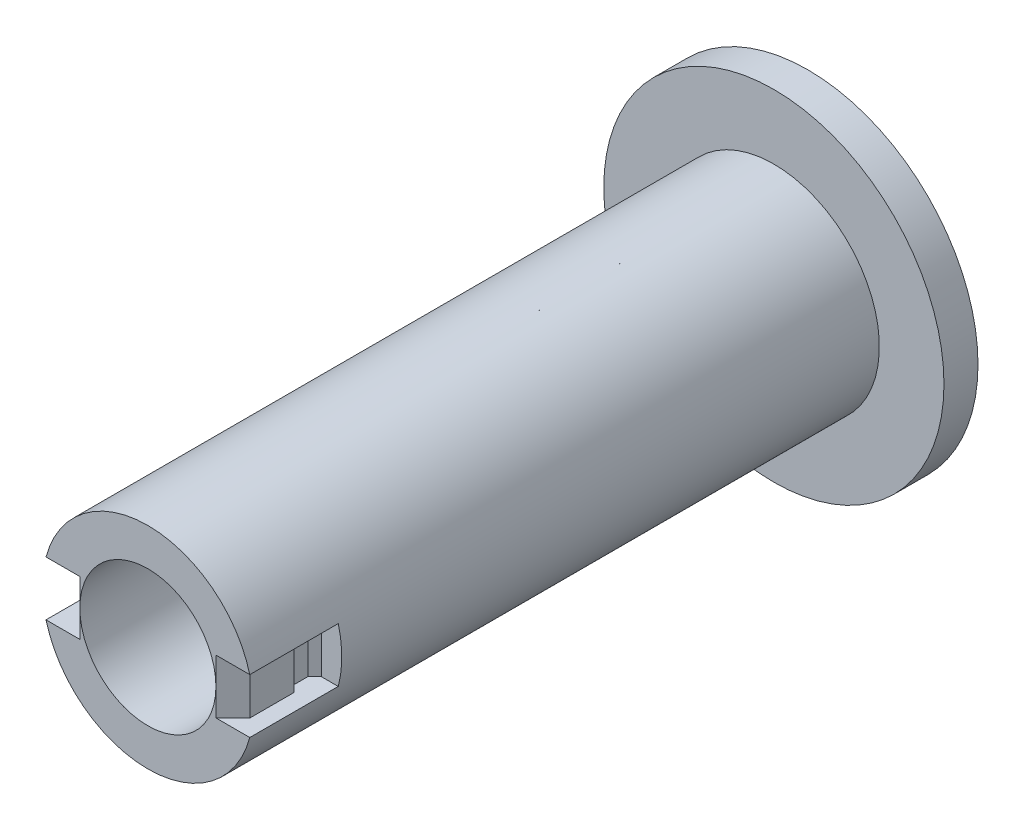
ISO-10303-21;
HEADER;
FILE_DESCRIPTION(('STEP AP214'),'2;1');
FILE_NAME('part.step','',(''),(''),'','','');
FILE_SCHEMA(('AUTOMOTIVE_DESIGN { 1 0 10303 214 1 1 1 1 }'));
ENDSEC;
DATA;
#1=APPLICATION_CONTEXT('core data for automotive mechanical design processes');
#2=APPLICATION_PROTOCOL_DEFINITION('international standard','automotive_design',2000,#1);
#3=PRODUCT_CONTEXT('',#1,'mechanical');
#4=PRODUCT('Part','Part','',(#3));
#5=PRODUCT_RELATED_PRODUCT_CATEGORY('part','',(#4));
#6=PRODUCT_DEFINITION_FORMATION('','',#4);
#7=PRODUCT_DEFINITION_CONTEXT('part definition',#1,'design');
#8=PRODUCT_DEFINITION('design','',#6,#7);
#9=PRODUCT_DEFINITION_SHAPE('','',#8);
#10=(LENGTH_UNIT() NAMED_UNIT(*) SI_UNIT(.MILLI.,.METRE.));
#11=(NAMED_UNIT(*) PLANE_ANGLE_UNIT() SI_UNIT($,.RADIAN.));
#12=(NAMED_UNIT(*) SI_UNIT($,.STERADIAN.) SOLID_ANGLE_UNIT());
#13=UNCERTAINTY_MEASURE_WITH_UNIT(LENGTH_MEASURE(1.E-05),#10,'distance_accuracy_value','');
#14=(GEOMETRIC_REPRESENTATION_CONTEXT(3) GLOBAL_UNCERTAINTY_ASSIGNED_CONTEXT((#13)) GLOBAL_UNIT_ASSIGNED_CONTEXT((#10,
#11,#12)) REPRESENTATION_CONTEXT('',''));
#15=CARTESIAN_POINT('',(0.,0.,0.));
#16=DIRECTION('',(0.,0.,1.));
#17=DIRECTION('',(1.,0.,0.));
#18=AXIS2_PLACEMENT_3D('',#15,#16,#17);
#19=CARTESIAN_POINT('',(0.,0.,92.));
#20=DIRECTION('',(0.,0.,1.));
#21=DIRECTION('',(1.,0.,0.));
#22=AXIS2_PLACEMENT_3D('',#19,#20,#21);
#23=PLANE('',#22);
#24=DIRECTION('',(-1.,0.,0.));
#25=VECTOR('',#24,1.);
#26=CARTESIAN_POINT('',(0.,4.,92.));
#27=LINE('',#26,#25);
#28=CARTESIAN_POINT('',(-10.,4.,92.));
#29=VERTEX_POINT('',#28);
#30=CARTESIAN_POINT('',(-14.9749791318719,4.,92.));
#31=VERTEX_POINT('',#30);
#32=EDGE_CURVE('E190',#29,#31,#27,.T.);
#33=ORIENTED_EDGE('',*,*,#32,.F.);
#34=DIRECTION('',(0.,-1.,0.));
#35=VECTOR('',#34,1.);
#36=CARTESIAN_POINT('',(-10.,4.,92.));
#37=LINE('',#36,#35);
#38=CARTESIAN_POINT('',(-10.,0.,92.));
#39=VERTEX_POINT('',#38);
#40=EDGE_CURVE('E168',#29,#39,#37,.T.);
#41=ORIENTED_EDGE('',*,*,#40,.T.);
#42=CARTESIAN_POINT('',(0.,0.,92.));
#43=DIRECTION('',(0.,0.,1.));
#44=DIRECTION('',(1.,0.,0.));
#45=AXIS2_PLACEMENT_3D('',#42,#43,#44);
#46=CIRCLE('',#45,10.);
#47=CARTESIAN_POINT('',(10.,0.,92.));
#48=VERTEX_POINT('',#47);
#49=EDGE_CURVE('E276',#48,#39,#46,.T.);
#50=ORIENTED_EDGE('',*,*,#49,.F.);
#51=DIRECTION('',(0.,-1.,0.));
#52=VECTOR('',#51,1.);
#53=CARTESIAN_POINT('',(10.,4.,92.));
#54=LINE('',#53,#52);
#55=CARTESIAN_POINT('',(10.,4.,92.));
#56=VERTEX_POINT('',#55);
#57=EDGE_CURVE('E255',#56,#48,#54,.T.);
#58=ORIENTED_EDGE('',*,*,#57,.F.);
#59=DIRECTION('',(1.,0.,0.));
#60=VECTOR('',#59,1.);
#61=CARTESIAN_POINT('',(0.,4.,92.));
#62=LINE('',#61,#60);
#63=CARTESIAN_POINT('',(14.9749791318719,4.,92.));
#64=VERTEX_POINT('',#63);
#65=EDGE_CURVE('E246',#56,#64,#62,.T.);
#66=ORIENTED_EDGE('',*,*,#65,.T.);
#67=CARTESIAN_POINT('',(0.,0.,92.));
#68=DIRECTION('',(0.,0.,1.));
#69=DIRECTION('',(1.,0.,0.));
#70=AXIS2_PLACEMENT_3D('',#67,#68,#69);
#71=CIRCLE('',#70,15.5);
#72=EDGE_CURVE('E288',#64,#31,#71,.T.);
#73=ORIENTED_EDGE('',*,*,#72,.T.);
#74=EDGE_LOOP('',(#33,#41,#50,#58,#66,#73));
#75=FACE_BOUND('',#74,.T.);
#76=ADVANCED_FACE('F32',(#75),#23,.T.);
#77=CARTESIAN_POINT('',(0.,0.,92.));
#78=DIRECTION('',(0.,0.,-1.));
#79=DIRECTION('',(-1.,0.,0.));
#80=AXIS2_PLACEMENT_3D('',#77,#78,#79);
#81=CYLINDRICAL_SURFACE('',#80,15.5);
#82=CARTESIAN_POINT('',(0.,0.,79.));
#83=DIRECTION('',(0.,0.,-1.));
#84=DIRECTION('',(-1.,0.,0.));
#85=AXIS2_PLACEMENT_3D('',#82,#83,#84);
#86=CIRCLE('',#85,15.5);
#87=CARTESIAN_POINT('',(-14.9749791318719,-4.,79.));
#88=VERTEX_POINT('',#87);
#89=CARTESIAN_POINT('',(-14.9749791318719,4.,79.));
#90=VERTEX_POINT('',#89);
#91=EDGE_CURVE('E11',#88,#90,#86,.T.);
#92=ORIENTED_EDGE('',*,*,#91,.T.);
#93=DIRECTION('',(0.,0.,-1.));
#94=VECTOR('',#93,1.);
#95=CARTESIAN_POINT('',(-14.9749791318719,4.,92.));
#96=LINE('',#95,#94);
#97=EDGE_CURVE('E216',#90,#31,#96,.F.);
#98=ORIENTED_EDGE('',*,*,#97,.T.);
#99=ORIENTED_EDGE('',*,*,#72,.F.);
#100=DIRECTION('',(0.,0.,-1.));
#101=VECTOR('',#100,1.);
#102=CARTESIAN_POINT('',(14.9749791318719,4.,92.));
#103=LINE('',#102,#101);
#104=CARTESIAN_POINT('',(14.9749791318719,4.,79.));
#105=VERTEX_POINT('',#104);
#106=EDGE_CURVE('E268',#64,#105,#103,.T.);
#107=ORIENTED_EDGE('',*,*,#106,.T.);
#108=CARTESIAN_POINT('',(0.,0.,79.));
#109=DIRECTION('',(0.,0.,1.));
#110=DIRECTION('',(1.,0.,0.));
#111=AXIS2_PLACEMENT_3D('',#108,#109,#110);
#112=CIRCLE('',#111,15.5);
#113=CARTESIAN_POINT('',(14.9749791318719,-4.,79.));
#114=VERTEX_POINT('',#113);
#115=EDGE_CURVE('E40',#114,#105,#112,.T.);
#116=ORIENTED_EDGE('',*,*,#115,.F.);
#117=DIRECTION('',(0.,0.,-1.));
#118=VECTOR('',#117,1.);
#119=CARTESIAN_POINT('',(14.9749791318719,-4.,92.));
#120=LINE('',#119,#118);
#121=CARTESIAN_POINT('',(14.9749791318719,-4.,92.));
#122=VERTEX_POINT('',#121);
#123=EDGE_CURVE('E266',#122,#114,#120,.T.);
#124=ORIENTED_EDGE('',*,*,#123,.F.);
#125=CARTESIAN_POINT('',(-14.9749791318719,-4.,92.));
#126=VERTEX_POINT('',#125);
#127=EDGE_CURVE('E287',#126,#122,#71,.T.);
#128=ORIENTED_EDGE('',*,*,#127,.F.);
#129=DIRECTION('',(0.,0.,-1.));
#130=VECTOR('',#129,1.);
#131=CARTESIAN_POINT('',(-14.9749791318719,-4.,92.));
#132=LINE('',#131,#130);
#133=EDGE_CURVE('E47',#88,#126,#132,.F.);
#134=ORIENTED_EDGE('',*,*,#133,.F.);
#135=EDGE_LOOP('',(#92,#98,#99,#107,#116,#124,#128,#134));
#136=FACE_BOUND('',#135,.T.);
#137=CARTESIAN_POINT('',(0.,0.,0.));
#138=DIRECTION('',(0.,0.,-1.));
#139=DIRECTION('',(-1.,0.,0.));
#140=AXIS2_PLACEMENT_3D('',#137,#138,#139);
#141=CIRCLE('',#140,15.5);
#142=CARTESIAN_POINT('',(-15.5,0.,0.));
#143=VERTEX_POINT('',#142);
#144=EDGE_CURVE('E282',#143,#143,#141,.T.);
#145=ORIENTED_EDGE('',*,*,#144,.F.);
#146=EDGE_LOOP('',(#145));
#147=FACE_BOUND('',#146,.T.);
#148=ADVANCED_FACE('F34',(#136,#147),#81,.T.);
#149=CARTESIAN_POINT('',(-10.,-4.,92.));
#150=VERTEX_POINT('',#149);
#151=EDGE_CURVE('E212',#39,#150,#37,.T.);
#152=ORIENTED_EDGE('',*,*,#151,.T.);
#153=DIRECTION('',(-1.,0.,0.));
#154=VECTOR('',#153,1.);
#155=CARTESIAN_POINT('',(0.,-4.,92.));
#156=LINE('',#155,#154);
#157=EDGE_CURVE('E160',#150,#126,#156,.T.);
#158=ORIENTED_EDGE('',*,*,#157,.T.);
#159=ORIENTED_EDGE('',*,*,#127,.T.);
#160=DIRECTION('',(1.,0.,0.));
#161=VECTOR('',#160,1.);
#162=CARTESIAN_POINT('',(0.,-4.,92.));
#163=LINE('',#162,#161);
#164=CARTESIAN_POINT('',(10.,-4.,92.));
#165=VERTEX_POINT('',#164);
#166=EDGE_CURVE('E231',#165,#122,#163,.T.);
#167=ORIENTED_EDGE('',*,*,#166,.F.);
#168=EDGE_CURVE('E254',#48,#165,#54,.T.);
#169=ORIENTED_EDGE('',*,*,#168,.F.);
#170=EDGE_CURVE('E271',#39,#48,#46,.T.);
#171=ORIENTED_EDGE('',*,*,#170,.F.);
#172=EDGE_LOOP('',(#152,#158,#159,#167,#169,#171));
#173=FACE_BOUND('',#172,.T.);
#174=ADVANCED_FACE('F336',(#173),#23,.T.);
#175=CARTESIAN_POINT('',(0.,0.,0.));
#176=DIRECTION('',(0.,0.,-1.));
#177=DIRECTION('',(-1.,0.,0.));
#178=AXIS2_PLACEMENT_3D('',#175,#176,#177);
#179=PLANE('',#178);
#180=CARTESIAN_POINT('',(0.,0.,0.));
#181=DIRECTION('',(0.,0.,-1.));
#182=DIRECTION('',(-1.,0.,0.));
#183=AXIS2_PLACEMENT_3D('',#180,#181,#182);
#184=CIRCLE('',#183,25.);
#185=CARTESIAN_POINT('',(-25.,0.,0.));
#186=VERTEX_POINT('',#185);
#187=EDGE_CURVE('E275',#186,#186,#184,.T.);
#188=ORIENTED_EDGE('',*,*,#187,.F.);
#189=EDGE_LOOP('',(#188));
#190=FACE_BOUND('',#189,.T.);
#191=ORIENTED_EDGE('',*,*,#144,.T.);
#192=EDGE_LOOP('',(#191));
#193=FACE_BOUND('',#192,.T.);
#194=ADVANCED_FACE('F369',(#190,#193),#179,.F.);
#195=CARTESIAN_POINT('',(0.,0.,-5.));
#196=DIRECTION('',(0.,0.,1.));
#197=DIRECTION('',(1.,0.,0.));
#198=AXIS2_PLACEMENT_3D('',#195,#196,#197);
#199=CYLINDRICAL_SURFACE('',#198,25.);
#200=CARTESIAN_POINT('',(0.,0.,-5.));
#201=DIRECTION('',(0.,0.,-1.));
#202=DIRECTION('',(-1.,0.,0.));
#203=AXIS2_PLACEMENT_3D('',#200,#201,#202);
#204=CIRCLE('',#203,25.);
#205=CARTESIAN_POINT('',(-25.,0.,-5.));
#206=VERTEX_POINT('',#205);
#207=EDGE_CURVE('E279',#206,#206,#204,.T.);
#208=ORIENTED_EDGE('',*,*,#207,.F.);
#209=EDGE_LOOP('',(#208));
#210=FACE_BOUND('',#209,.T.);
#211=ORIENTED_EDGE('',*,*,#187,.T.);
#212=EDGE_LOOP('',(#211));
#213=FACE_BOUND('',#212,.T.);
#214=ADVANCED_FACE('F373',(#210,#213),#199,.T.);
#215=CARTESIAN_POINT('',(0.,0.,-5.));
#216=DIRECTION('',(0.,0.,-1.));
#217=DIRECTION('',(-1.,0.,0.));
#218=AXIS2_PLACEMENT_3D('',#215,#216,#217);
#219=PLANE('',#218);
#220=CARTESIAN_POINT('',(0.,0.,-5.));
#221=DIRECTION('',(0.,0.,1.));
#222=DIRECTION('',(1.,0.,0.));
#223=AXIS2_PLACEMENT_3D('',#220,#221,#222);
#224=CIRCLE('',#223,10.);
#225=CARTESIAN_POINT('',(10.,0.,-5.));
#226=VERTEX_POINT('',#225);
#227=EDGE_CURVE('E272',#226,#226,#224,.T.);
#228=ORIENTED_EDGE('',*,*,#227,.T.);
#229=EDGE_LOOP('',(#228));
#230=FACE_BOUND('',#229,.T.);
#231=ORIENTED_EDGE('',*,*,#207,.T.);
#232=EDGE_LOOP('',(#231));
#233=FACE_BOUND('',#232,.T.);
#234=ADVANCED_FACE('F379',(#230,#233),#219,.T.);
#235=CARTESIAN_POINT('',(0.,0.,-5.));
#236=DIRECTION('',(0.,0.,1.));
#237=DIRECTION('',(1.,0.,0.));
#238=AXIS2_PLACEMENT_3D('',#235,#236,#237);
#239=CYLINDRICAL_SURFACE('',#238,10.);
#240=ORIENTED_EDGE('',*,*,#227,.F.);
#241=EDGE_LOOP('',(#240));
#242=FACE_BOUND('',#241,.T.);
#243=ORIENTED_EDGE('',*,*,#49,.T.);
#244=ORIENTED_EDGE('',*,*,#170,.T.);
#245=EDGE_LOOP('',(#243,#244));
#246=FACE_BOUND('',#245,.T.);
#247=ADVANCED_FACE('F386',(#242,#246),#239,.F.);
#248=CARTESIAN_POINT('',(0.,4.,79.));
#249=DIRECTION('',(0.,0.,1.));
#250=DIRECTION('',(1.,0.,0.));
#251=AXIS2_PLACEMENT_3D('',#248,#249,#250);
#252=PLANE('',#251);
#253=ORIENTED_EDGE('',*,*,#115,.T.);
#254=DIRECTION('',(-1.,0.,0.));
#255=VECTOR('',#254,1.);
#256=CARTESIAN_POINT('',(0.,4.,79.));
#257=LINE('',#256,#255);
#258=CARTESIAN_POINT('',(12.5,4.,79.));
#259=VERTEX_POINT('',#258);
#260=EDGE_CURVE('E249',#105,#259,#257,.T.);
#261=ORIENTED_EDGE('',*,*,#260,.T.);
#262=DIRECTION('',(0.,-1.,0.));
#263=VECTOR('',#262,1.);
#264=CARTESIAN_POINT('',(12.5,4.,79.));
#265=LINE('',#264,#263);
#266=CARTESIAN_POINT('',(12.5,-4.,79.));
#267=VERTEX_POINT('',#266);
#268=EDGE_CURVE('E251',#259,#267,#265,.T.);
#269=ORIENTED_EDGE('',*,*,#268,.T.);
#270=DIRECTION('',(-1.,0.,0.));
#271=VECTOR('',#270,1.);
#272=CARTESIAN_POINT('',(0.,-4.,79.));
#273=LINE('',#272,#271);
#274=EDGE_CURVE('E233',#114,#267,#273,.T.);
#275=ORIENTED_EDGE('',*,*,#274,.F.);
#276=EDGE_LOOP('',(#253,#261,#269,#275));
#277=FACE_BOUND('',#276,.T.);
#278=ADVANCED_FACE('F294',(#277),#252,.T.);
#279=CARTESIAN_POINT('',(0.,4.,0.));
#280=DIRECTION('',(0.,1.,0.));
#281=DIRECTION('',(0.,0.,1.));
#282=AXIS2_PLACEMENT_3D('',#279,#280,#281);
#283=PLANE('',#282);
#284=ORIENTED_EDGE('',*,*,#65,.F.);
#285=DIRECTION('',(-0.707106781186547,0.,0.707106781186548));
#286=VECTOR('',#285,1.);
#287=CARTESIAN_POINT('',(51.,4.,51.));
#288=LINE('',#287,#286);
#289=CARTESIAN_POINT('',(12.5,4.,89.5));
#290=VERTEX_POINT('',#289);
#291=EDGE_CURVE('E244',#290,#56,#288,.T.);
#292=ORIENTED_EDGE('',*,*,#291,.F.);
#293=DIRECTION('',(0.,0.,1.));
#294=VECTOR('',#293,1.);
#295=CARTESIAN_POINT('',(12.5,4.,0.));
#296=LINE('',#295,#294);
#297=CARTESIAN_POINT('',(12.5,4.,83.));
#298=VERTEX_POINT('',#297);
#299=EDGE_CURVE('E242',#298,#290,#296,.T.);
#300=ORIENTED_EDGE('',*,*,#299,.F.);
#301=DIRECTION('',(0.707106781186552,0.,0.707106781186543));
#302=VECTOR('',#301,1.);
#303=CARTESIAN_POINT('',(-35.2500000000001,4.,35.2500000000006));
#304=LINE('',#303,#302);
#305=CARTESIAN_POINT('',(11.5,4.,82.));
#306=VERTEX_POINT('',#305);
#307=EDGE_CURVE('E240',#306,#298,#304,.T.);
#308=ORIENTED_EDGE('',*,*,#307,.F.);
#309=DIRECTION('',(0.,0.,1.));
#310=VECTOR('',#309,1.);
#311=CARTESIAN_POINT('',(11.5,4.,0.));
#312=LINE('',#311,#310);
#313=CARTESIAN_POINT('',(11.5,4.,80.));
#314=VERTEX_POINT('',#313);
#315=EDGE_CURVE('E238',#314,#306,#312,.T.);
#316=ORIENTED_EDGE('',*,*,#315,.F.);
#317=DIRECTION('',(-0.707106781186543,0.,0.707106781186552));
#318=VECTOR('',#317,1.);
#319=CARTESIAN_POINT('',(45.7500000000001,4.,45.7499999999995));
#320=LINE('',#319,#318);
#321=EDGE_CURVE('E235',#259,#314,#320,.T.);
#322=ORIENTED_EDGE('',*,*,#321,.F.);
#323=ORIENTED_EDGE('',*,*,#260,.F.);
#324=ORIENTED_EDGE('',*,*,#106,.F.);
#325=EDGE_LOOP('',(#284,#292,#300,#308,#316,#322,#323,#324));
#326=FACE_BOUND('',#325,.T.);
#327=ADVANCED_FACE('F301',(#326),#283,.F.);
#328=CARTESIAN_POINT('',(0.,-4.,0.));
#329=DIRECTION('',(0.,1.,0.));
#330=DIRECTION('',(0.,0.,1.));
#331=AXIS2_PLACEMENT_3D('',#328,#329,#330);
#332=PLANE('',#331);
#333=ORIENTED_EDGE('',*,*,#123,.T.);
#334=ORIENTED_EDGE('',*,*,#274,.T.);
#335=DIRECTION('',(-0.707106781186543,0.,0.707106781186552));
#336=VECTOR('',#335,1.);
#337=CARTESIAN_POINT('',(45.7500000000001,-4.,45.7499999999995));
#338=LINE('',#337,#336);
#339=CARTESIAN_POINT('',(11.5,-4.,80.));
#340=VERTEX_POINT('',#339);
#341=EDGE_CURVE('E219',#267,#340,#338,.T.);
#342=ORIENTED_EDGE('',*,*,#341,.T.);
#343=DIRECTION('',(0.,0.,1.));
#344=VECTOR('',#343,1.);
#345=CARTESIAN_POINT('',(11.5,-4.,0.));
#346=LINE('',#345,#344);
#347=CARTESIAN_POINT('',(11.5,-4.,82.));
#348=VERTEX_POINT('',#347);
#349=EDGE_CURVE('E222',#340,#348,#346,.T.);
#350=ORIENTED_EDGE('',*,*,#349,.T.);
#351=DIRECTION('',(0.707106781186552,0.,0.707106781186543));
#352=VECTOR('',#351,1.);
#353=CARTESIAN_POINT('',(-35.2500000000001,-4.,35.2500000000006));
#354=LINE('',#353,#352);
#355=CARTESIAN_POINT('',(12.5,-4.,83.));
#356=VERTEX_POINT('',#355);
#357=EDGE_CURVE('E225',#348,#356,#354,.T.);
#358=ORIENTED_EDGE('',*,*,#357,.T.);
#359=DIRECTION('',(0.,0.,1.));
#360=VECTOR('',#359,1.);
#361=CARTESIAN_POINT('',(12.5,-4.,0.));
#362=LINE('',#361,#360);
#363=CARTESIAN_POINT('',(12.5,-4.,89.5));
#364=VERTEX_POINT('',#363);
#365=EDGE_CURVE('E228',#356,#364,#362,.T.);
#366=ORIENTED_EDGE('',*,*,#365,.T.);
#367=DIRECTION('',(-0.707106781186547,0.,0.707106781186548));
#368=VECTOR('',#367,1.);
#369=CARTESIAN_POINT('',(51.,-4.,51.));
#370=LINE('',#369,#368);
#371=EDGE_CURVE('E55',#364,#165,#370,.T.);
#372=ORIENTED_EDGE('',*,*,#371,.T.);
#373=ORIENTED_EDGE('',*,*,#166,.T.);
#374=EDGE_LOOP('',(#333,#334,#342,#350,#358,#366,#372,#373));
#375=FACE_BOUND('',#374,.T.);
#376=ADVANCED_FACE('F331',(#375),#332,.T.);
#377=CARTESIAN_POINT('',(45.7500000000001,4.,45.7499999999995));
#378=DIRECTION('',(0.707106781186552,0.,0.707106781186543));
#379=DIRECTION('',(0.707106781186543,0.,-0.707106781186552));
#380=AXIS2_PLACEMENT_3D('',#377,#378,#379);
#381=PLANE('',#380);
#382=ORIENTED_EDGE('',*,*,#268,.F.);
#383=ORIENTED_EDGE('',*,*,#321,.T.);
#384=DIRECTION('',(0.,-1.,0.));
#385=VECTOR('',#384,1.);
#386=CARTESIAN_POINT('',(11.5,4.,80.));
#387=LINE('',#386,#385);
#388=EDGE_CURVE('E264',#314,#340,#387,.T.);
#389=ORIENTED_EDGE('',*,*,#388,.T.);
#390=ORIENTED_EDGE('',*,*,#341,.F.);
#391=EDGE_LOOP('',(#382,#383,#389,#390));
#392=FACE_BOUND('',#391,.T.);
#393=ADVANCED_FACE('F327',(#392),#381,.T.);
#394=CARTESIAN_POINT('',(11.5,4.,0.));
#395=DIRECTION('',(1.,0.,0.));
#396=DIRECTION('',(0.,0.,-1.));
#397=AXIS2_PLACEMENT_3D('',#394,#395,#396);
#398=PLANE('',#397);
#399=ORIENTED_EDGE('',*,*,#388,.F.);
#400=ORIENTED_EDGE('',*,*,#315,.T.);
#401=DIRECTION('',(0.,-1.,0.));
#402=VECTOR('',#401,1.);
#403=CARTESIAN_POINT('',(11.5,4.,82.));
#404=LINE('',#403,#402);
#405=EDGE_CURVE('E262',#306,#348,#404,.T.);
#406=ORIENTED_EDGE('',*,*,#405,.T.);
#407=ORIENTED_EDGE('',*,*,#349,.F.);
#408=EDGE_LOOP('',(#399,#400,#406,#407));
#409=FACE_BOUND('',#408,.T.);
#410=ADVANCED_FACE('F330',(#409),#398,.T.);
#411=CARTESIAN_POINT('',(-35.2500000000001,4.,35.2500000000006));
#412=DIRECTION('',(0.707106781186543,0.,-0.707106781186552));
#413=DIRECTION('',(-0.707106781186552,0.,-0.707106781186543));
#414=AXIS2_PLACEMENT_3D('',#411,#412,#413);
#415=PLANE('',#414);
#416=ORIENTED_EDGE('',*,*,#405,.F.);
#417=ORIENTED_EDGE('',*,*,#307,.T.);
#418=DIRECTION('',(0.,-1.,0.));
#419=VECTOR('',#418,1.);
#420=CARTESIAN_POINT('',(12.5,4.,83.));
#421=LINE('',#420,#419);
#422=EDGE_CURVE('E260',#298,#356,#421,.T.);
#423=ORIENTED_EDGE('',*,*,#422,.T.);
#424=ORIENTED_EDGE('',*,*,#357,.F.);
#425=EDGE_LOOP('',(#416,#417,#423,#424));
#426=FACE_BOUND('',#425,.T.);
#427=ADVANCED_FACE('F323',(#426),#415,.T.);
#428=CARTESIAN_POINT('',(12.5,4.,0.));
#429=DIRECTION('',(1.,0.,0.));
#430=DIRECTION('',(0.,0.,-1.));
#431=AXIS2_PLACEMENT_3D('',#428,#429,#430);
#432=PLANE('',#431);
#433=ORIENTED_EDGE('',*,*,#422,.F.);
#434=ORIENTED_EDGE('',*,*,#299,.T.);
#435=DIRECTION('',(0.,-1.,0.));
#436=VECTOR('',#435,1.);
#437=CARTESIAN_POINT('',(12.5,4.,89.5));
#438=LINE('',#437,#436);
#439=EDGE_CURVE('E258',#290,#364,#438,.T.);
#440=ORIENTED_EDGE('',*,*,#439,.T.);
#441=ORIENTED_EDGE('',*,*,#365,.F.);
#442=EDGE_LOOP('',(#433,#434,#440,#441));
#443=FACE_BOUND('',#442,.T.);
#444=ADVANCED_FACE('F319',(#443),#432,.T.);
#445=CARTESIAN_POINT('',(51.,4.,51.));
#446=DIRECTION('',(0.707106781186548,0.,0.707106781186547));
#447=DIRECTION('',(0.707106781186547,0.,-0.707106781186548));
#448=AXIS2_PLACEMENT_3D('',#445,#446,#447);
#449=PLANE('',#448);
#450=ORIENTED_EDGE('',*,*,#439,.F.);
#451=ORIENTED_EDGE('',*,*,#291,.T.);
#452=ORIENTED_EDGE('',*,*,#57,.T.);
#453=ORIENTED_EDGE('',*,*,#168,.T.);
#454=ORIENTED_EDGE('',*,*,#371,.F.);
#455=EDGE_LOOP('',(#450,#451,#452,#453,#454));
#456=FACE_BOUND('',#455,.T.);
#457=ADVANCED_FACE('F314',(#456),#449,.T.);
#458=CARTESIAN_POINT('',(0.,4.,79.));
#459=DIRECTION('',(0.,0.,-1.));
#460=DIRECTION('',(-1.,0.,0.));
#461=AXIS2_PLACEMENT_3D('',#458,#459,#460);
#462=PLANE('',#461);
#463=ORIENTED_EDGE('',*,*,#91,.F.);
#464=DIRECTION('',(1.,0.,0.));
#465=VECTOR('',#464,1.);
#466=CARTESIAN_POINT('',(0.,-4.,79.));
#467=LINE('',#466,#465);
#468=CARTESIAN_POINT('',(-12.5,-4.,79.));
#469=VERTEX_POINT('',#468);
#470=EDGE_CURVE('E153',#88,#469,#467,.T.);
#471=ORIENTED_EDGE('',*,*,#470,.T.);
#472=DIRECTION('',(0.,-1.,0.));
#473=VECTOR('',#472,1.);
#474=CARTESIAN_POINT('',(-12.5,4.,79.));
#475=LINE('',#474,#473);
#476=CARTESIAN_POINT('',(-12.5,4.,79.));
#477=VERTEX_POINT('',#476);
#478=EDGE_CURVE('E157',#477,#469,#475,.T.);
#479=ORIENTED_EDGE('',*,*,#478,.F.);
#480=DIRECTION('',(1.,0.,0.));
#481=VECTOR('',#480,1.);
#482=CARTESIAN_POINT('',(0.,4.,79.));
#483=LINE('',#482,#481);
#484=EDGE_CURVE('E188',#90,#477,#483,.T.);
#485=ORIENTED_EDGE('',*,*,#484,.F.);
#486=EDGE_LOOP('',(#463,#471,#479,#485));
#487=FACE_BOUND('',#486,.T.);
#488=ADVANCED_FACE('F155',(#487),#462,.F.);
#489=CARTESIAN_POINT('',(0.,4.,0.));
#490=DIRECTION('',(0.,1.,0.));
#491=DIRECTION('',(0.,0.,1.));
#492=AXIS2_PLACEMENT_3D('',#489,#490,#491);
#493=PLANE('',#492);
#494=ORIENTED_EDGE('',*,*,#484,.T.);
#495=DIRECTION('',(0.707106781186543,0.,0.707106781186552));
#496=VECTOR('',#495,1.);
#497=CARTESIAN_POINT('',(-45.7500000000001,4.,45.7499999999995));
#498=LINE('',#497,#496);
#499=CARTESIAN_POINT('',(-11.5,4.,80.));
#500=VERTEX_POINT('',#499);
#501=EDGE_CURVE('E167',#477,#500,#498,.T.);
#502=ORIENTED_EDGE('',*,*,#501,.T.);
#503=DIRECTION('',(0.,0.,1.));
#504=VECTOR('',#503,1.);
#505=CARTESIAN_POINT('',(-11.5,4.,0.));
#506=LINE('',#505,#504);
#507=CARTESIAN_POINT('',(-11.5,4.,82.));
#508=VERTEX_POINT('',#507);
#509=EDGE_CURVE('E201',#500,#508,#506,.T.);
#510=ORIENTED_EDGE('',*,*,#509,.T.);
#511=DIRECTION('',(-0.707106781186552,0.,0.707106781186543));
#512=VECTOR('',#511,1.);
#513=CARTESIAN_POINT('',(35.2500000000001,4.,35.2500000000006));
#514=LINE('',#513,#512);
#515=CARTESIAN_POINT('',(-12.5,4.,83.));
#516=VERTEX_POINT('',#515);
#517=EDGE_CURVE('E198',#508,#516,#514,.T.);
#518=ORIENTED_EDGE('',*,*,#517,.T.);
#519=DIRECTION('',(0.,0.,1.));
#520=VECTOR('',#519,1.);
#521=CARTESIAN_POINT('',(-12.5,4.,0.));
#522=LINE('',#521,#520);
#523=CARTESIAN_POINT('',(-12.5,4.,89.5));
#524=VERTEX_POINT('',#523);
#525=EDGE_CURVE('E195',#516,#524,#522,.T.);
#526=ORIENTED_EDGE('',*,*,#525,.T.);
#527=DIRECTION('',(0.707106781186547,0.,0.707106781186548));
#528=VECTOR('',#527,1.);
#529=CARTESIAN_POINT('',(-51.,4.,51.));
#530=LINE('',#529,#528);
#531=EDGE_CURVE('E192',#524,#29,#530,.T.);
#532=ORIENTED_EDGE('',*,*,#531,.T.);
#533=ORIENTED_EDGE('',*,*,#32,.T.);
#534=ORIENTED_EDGE('',*,*,#97,.F.);
#535=EDGE_LOOP('',(#494,#502,#510,#518,#526,#532,#533,#534));
#536=FACE_BOUND('',#535,.T.);
#537=ADVANCED_FACE('F353',(#536),#493,.F.);
#538=CARTESIAN_POINT('',(0.,-4.,0.));
#539=DIRECTION('',(0.,1.,0.));
#540=DIRECTION('',(0.,0.,1.));
#541=AXIS2_PLACEMENT_3D('',#538,#539,#540);
#542=PLANE('',#541);
#543=ORIENTED_EDGE('',*,*,#133,.T.);
#544=ORIENTED_EDGE('',*,*,#157,.F.);
#545=DIRECTION('',(0.707106781186547,0.,0.707106781186548));
#546=VECTOR('',#545,1.);
#547=CARTESIAN_POINT('',(-51.,-4.,51.));
#548=LINE('',#547,#546);
#549=CARTESIAN_POINT('',(-12.5,-4.,89.5));
#550=VERTEX_POINT('',#549);
#551=EDGE_CURVE('E178',#550,#150,#548,.T.);
#552=ORIENTED_EDGE('',*,*,#551,.F.);
#553=DIRECTION('',(0.,0.,1.));
#554=VECTOR('',#553,1.);
#555=CARTESIAN_POINT('',(-12.5,-4.,0.));
#556=LINE('',#555,#554);
#557=CARTESIAN_POINT('',(-12.5,-4.,83.));
#558=VERTEX_POINT('',#557);
#559=EDGE_CURVE('E180',#558,#550,#556,.T.);
#560=ORIENTED_EDGE('',*,*,#559,.F.);
#561=DIRECTION('',(-0.707106781186552,0.,0.707106781186543));
#562=VECTOR('',#561,1.);
#563=CARTESIAN_POINT('',(35.2500000000001,-4.,35.2500000000006));
#564=LINE('',#563,#562);
#565=CARTESIAN_POINT('',(-11.5,-4.,82.));
#566=VERTEX_POINT('',#565);
#567=EDGE_CURVE('E183',#566,#558,#564,.T.);
#568=ORIENTED_EDGE('',*,*,#567,.F.);
#569=DIRECTION('',(0.,0.,1.));
#570=VECTOR('',#569,1.);
#571=CARTESIAN_POINT('',(-11.5,-4.,0.));
#572=LINE('',#571,#570);
#573=CARTESIAN_POINT('',(-11.5,-4.,80.));
#574=VERTEX_POINT('',#573);
#575=EDGE_CURVE('E174',#574,#566,#572,.T.);
#576=ORIENTED_EDGE('',*,*,#575,.F.);
#577=DIRECTION('',(0.707106781186543,0.,0.707106781186552));
#578=VECTOR('',#577,1.);
#579=CARTESIAN_POINT('',(-45.7500000000001,-4.,45.7499999999995));
#580=LINE('',#579,#578);
#581=EDGE_CURVE('E161',#469,#574,#580,.T.);
#582=ORIENTED_EDGE('',*,*,#581,.F.);
#583=ORIENTED_EDGE('',*,*,#470,.F.);
#584=EDGE_LOOP('',(#543,#544,#552,#560,#568,#576,#582,#583));
#585=FACE_BOUND('',#584,.T.);
#586=ADVANCED_FACE('F171',(#585),#542,.T.);
#587=CARTESIAN_POINT('',(-45.7500000000001,4.,45.7499999999995));
#588=DIRECTION('',(0.707106781186552,0.,-0.707106781186543));
#589=DIRECTION('',(-0.707106781186543,0.,-0.707106781186552));
#590=AXIS2_PLACEMENT_3D('',#587,#588,#589);
#591=PLANE('',#590);
#592=DIRECTION('',(0.,-1.,0.));
#593=VECTOR('',#592,1.);
#594=CARTESIAN_POINT('',(-11.5,4.,80.));
#595=LINE('',#594,#593);
#596=EDGE_CURVE('E204',#500,#574,#595,.T.);
#597=ORIENTED_EDGE('',*,*,#596,.F.);
#598=ORIENTED_EDGE('',*,*,#501,.F.);
#599=ORIENTED_EDGE('',*,*,#478,.T.);
#600=ORIENTED_EDGE('',*,*,#581,.T.);
#601=EDGE_LOOP('',(#597,#598,#599,#600));
#602=FACE_BOUND('',#601,.T.);
#603=ADVANCED_FACE('F165',(#602),#591,.F.);
#604=CARTESIAN_POINT('',(-51.,4.,51.));
#605=DIRECTION('',(0.707106781186548,0.,-0.707106781186547));
#606=DIRECTION('',(-0.707106781186547,0.,-0.707106781186548));
#607=AXIS2_PLACEMENT_3D('',#604,#605,#606);
#608=PLANE('',#607);
#609=ORIENTED_EDGE('',*,*,#40,.F.);
#610=ORIENTED_EDGE('',*,*,#531,.F.);
#611=DIRECTION('',(0.,-1.,0.));
#612=VECTOR('',#611,1.);
#613=CARTESIAN_POINT('',(-12.5,4.,89.5));
#614=LINE('',#613,#612);
#615=EDGE_CURVE('E210',#524,#550,#614,.T.);
#616=ORIENTED_EDGE('',*,*,#615,.T.);
#617=ORIENTED_EDGE('',*,*,#551,.T.);
#618=ORIENTED_EDGE('',*,*,#151,.F.);
#619=EDGE_LOOP('',(#609,#610,#616,#617,#618));
#620=FACE_BOUND('',#619,.T.);
#621=ADVANCED_FACE('F341',(#620),#608,.F.);
#622=CARTESIAN_POINT('',(-12.5,4.,0.));
#623=DIRECTION('',(1.,0.,0.));
#624=DIRECTION('',(0.,0.,-1.));
#625=AXIS2_PLACEMENT_3D('',#622,#623,#624);
#626=PLANE('',#625);
#627=ORIENTED_EDGE('',*,*,#615,.F.);
#628=ORIENTED_EDGE('',*,*,#525,.F.);
#629=DIRECTION('',(0.,-1.,0.));
#630=VECTOR('',#629,1.);
#631=CARTESIAN_POINT('',(-12.5,4.,83.));
#632=LINE('',#631,#630);
#633=EDGE_CURVE('E208',#516,#558,#632,.T.);
#634=ORIENTED_EDGE('',*,*,#633,.T.);
#635=ORIENTED_EDGE('',*,*,#559,.T.);
#636=EDGE_LOOP('',(#627,#628,#634,#635));
#637=FACE_BOUND('',#636,.T.);
#638=ADVANCED_FACE('F345',(#637),#626,.F.);
#639=CARTESIAN_POINT('',(35.2500000000001,4.,35.2500000000006));
#640=DIRECTION('',(0.707106781186543,0.,0.707106781186552));
#641=DIRECTION('',(0.707106781186552,0.,-0.707106781186543));
#642=AXIS2_PLACEMENT_3D('',#639,#640,#641);
#643=PLANE('',#642);
#644=ORIENTED_EDGE('',*,*,#633,.F.);
#645=ORIENTED_EDGE('',*,*,#517,.F.);
#646=DIRECTION('',(0.,-1.,0.));
#647=VECTOR('',#646,1.);
#648=CARTESIAN_POINT('',(-11.5,4.,82.));
#649=LINE('',#648,#647);
#650=EDGE_CURVE('E206',#508,#566,#649,.T.);
#651=ORIENTED_EDGE('',*,*,#650,.T.);
#652=ORIENTED_EDGE('',*,*,#567,.T.);
#653=EDGE_LOOP('',(#644,#645,#651,#652));
#654=FACE_BOUND('',#653,.T.);
#655=ADVANCED_FACE('F348',(#654),#643,.F.);
#656=CARTESIAN_POINT('',(-11.5,4.,0.));
#657=DIRECTION('',(1.,0.,0.));
#658=DIRECTION('',(0.,0.,-1.));
#659=AXIS2_PLACEMENT_3D('',#656,#657,#658);
#660=PLANE('',#659);
#661=ORIENTED_EDGE('',*,*,#650,.F.);
#662=ORIENTED_EDGE('',*,*,#509,.F.);
#663=ORIENTED_EDGE('',*,*,#596,.T.);
#664=ORIENTED_EDGE('',*,*,#575,.T.);
#665=EDGE_LOOP('',(#661,#662,#663,#664));
#666=FACE_BOUND('',#665,.T.);
#667=ADVANCED_FACE('F351',(#666),#660,.F.);
#668=CLOSED_SHELL('',(#76,#148,#174,#194,#214,#234,#247,#278,#327,#376,#393,#410,#427,#444,#457,
#488,#537,#586,#603,#621,#638,#655,#667));
#669=MANIFOLD_SOLID_BREP('B2',#668);
#670=ADVANCED_BREP_SHAPE_REPRESENTATION('',(#18,#669),#14);
#671=SHAPE_DEFINITION_REPRESENTATION(#9,#670);
ENDSEC;
END-ISO-10303-21;
